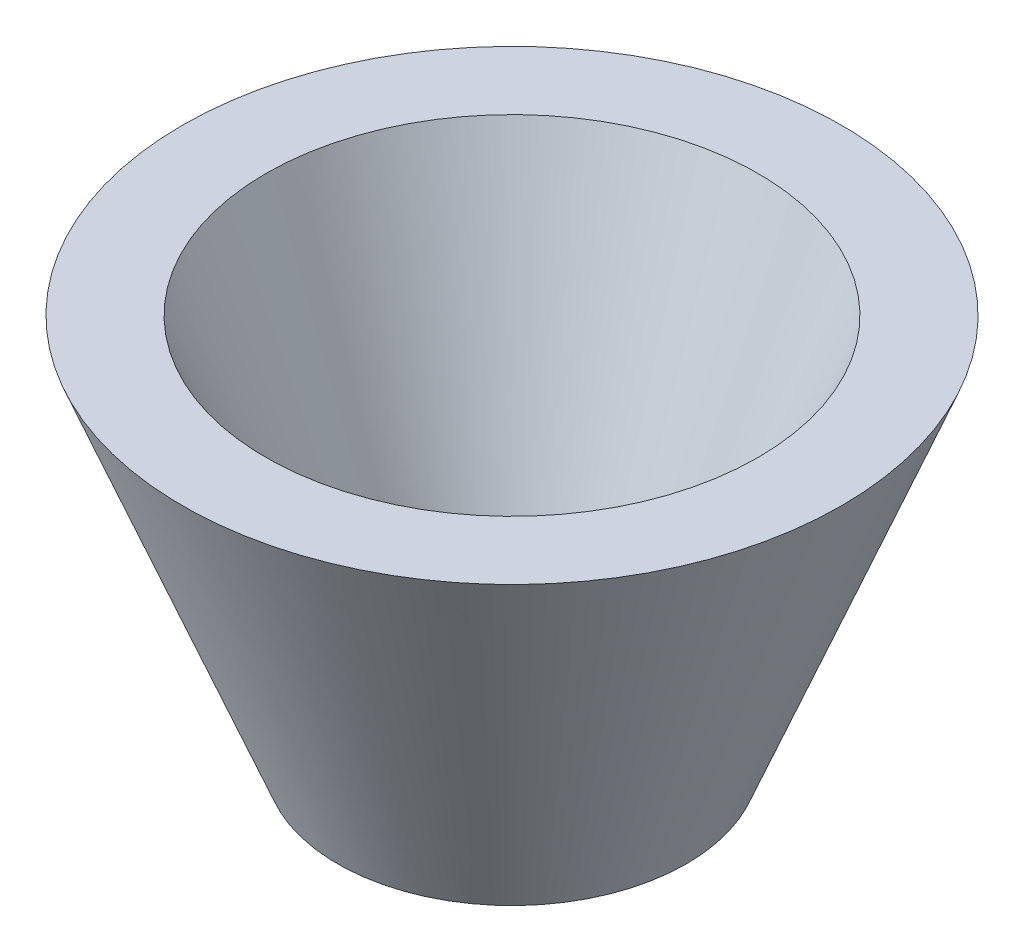
ISO-10303-21;
HEADER;
FILE_DESCRIPTION(('STEP AP214'),'2;1');
FILE_NAME('part.step','',(''),(''),'','','');
FILE_SCHEMA(('AUTOMOTIVE_DESIGN { 1 0 10303 214 1 1 1 1 }'));
ENDSEC;
DATA;
#1=APPLICATION_CONTEXT('core data for automotive mechanical design processes');
#2=APPLICATION_PROTOCOL_DEFINITION('international standard','automotive_design',2000,#1);
#3=PRODUCT_CONTEXT('',#1,'mechanical');
#4=PRODUCT('Part','Part','',(#3));
#5=PRODUCT_RELATED_PRODUCT_CATEGORY('part','',(#4));
#6=PRODUCT_DEFINITION_FORMATION('','',#4);
#7=PRODUCT_DEFINITION_CONTEXT('part definition',#1,'design');
#8=PRODUCT_DEFINITION('design','',#6,#7);
#9=PRODUCT_DEFINITION_SHAPE('','',#8);
#10=(LENGTH_UNIT() NAMED_UNIT(*) SI_UNIT(.MILLI.,.METRE.));
#11=(NAMED_UNIT(*) PLANE_ANGLE_UNIT() SI_UNIT($,.RADIAN.));
#12=(NAMED_UNIT(*) SI_UNIT($,.STERADIAN.) SOLID_ANGLE_UNIT());
#13=UNCERTAINTY_MEASURE_WITH_UNIT(LENGTH_MEASURE(1.E-05),#10,'distance_accuracy_value','');
#14=(GEOMETRIC_REPRESENTATION_CONTEXT(3) GLOBAL_UNCERTAINTY_ASSIGNED_CONTEXT((#13)) GLOBAL_UNIT_ASSIGNED_CONTEXT((#10,
#11,#12)) REPRESENTATION_CONTEXT('',''));
#15=CARTESIAN_POINT('',(0.,0.,0.));
#16=DIRECTION('',(0.,0.,1.));
#17=DIRECTION('',(1.,0.,0.));
#18=AXIS2_PLACEMENT_3D('',#15,#16,#17);
#19=CARTESIAN_POINT('',(0.,0.,0.));
#20=DIRECTION('',(0.,1.,0.));
#21=DIRECTION('',(-1.,0.,0.));
#22=AXIS2_PLACEMENT_3D('',#19,#20,#21);
#23=PLANE('',#22);
#24=CARTESIAN_POINT('',(0.,0.,0.));
#25=DIRECTION('',(0.,1.,0.));
#26=DIRECTION('',(-1.,0.,0.));
#27=AXIS2_PLACEMENT_3D('',#24,#25,#26);
#28=CIRCLE('',#27,4.5);
#29=CARTESIAN_POINT('',(-4.5,0.,0.));
#30=VERTEX_POINT('',#29);
#31=EDGE_CURVE('E10',#30,#30,#28,.T.);
#32=ORIENTED_EDGE('',*,*,#31,.F.);
#33=EDGE_LOOP('',(#32));
#34=FACE_BOUND('',#33,.T.);
#35=ADVANCED_FACE('F39',(#34),#23,.F.);
#36=CARTESIAN_POINT('',(0.,0.,0.));
#37=DIRECTION('',(0.,1.,0.));
#38=DIRECTION('',(-1.,0.,0.));
#39=AXIS2_PLACEMENT_3D('',#36,#37,#38);
#40=CONICAL_SURFACE('',#39,4.5,0.380506377112365);
#41=CARTESIAN_POINT('',(0.,10.,0.));
#42=DIRECTION('',(0.,1.,0.));
#43=DIRECTION('',(-1.,0.,0.));
#44=AXIS2_PLACEMENT_3D('',#41,#42,#43);
#45=CIRCLE('',#44,8.5);
#46=CARTESIAN_POINT('',(-8.5,10.,0.));
#47=VERTEX_POINT('',#46);
#48=EDGE_CURVE('E45',#47,#47,#45,.T.);
#49=ORIENTED_EDGE('',*,*,#48,.F.);
#50=EDGE_LOOP('',(#49));
#51=FACE_BOUND('',#50,.T.);
#52=ORIENTED_EDGE('',*,*,#31,.T.);
#53=EDGE_LOOP('',(#52));
#54=FACE_BOUND('',#53,.T.);
#55=ADVANCED_FACE('F65',(#51,#54),#40,.T.);
#56=CARTESIAN_POINT('',(8.5,10.,0.));
#57=DIRECTION('',(0.,-1.,0.));
#58=DIRECTION('',(1.,0.,0.));
#59=AXIS2_PLACEMENT_3D('',#56,#57,#58);
#60=PLANE('',#59);
#61=CARTESIAN_POINT('',(0.,10.,0.));
#62=DIRECTION('',(0.,-1.,0.));
#63=DIRECTION('',(1.,0.,0.));
#64=AXIS2_PLACEMENT_3D('',#61,#62,#63);
#65=CIRCLE('',#64,6.3459340771462);
#66=CARTESIAN_POINT('',(6.3459340771462,10.,0.));
#67=VERTEX_POINT('',#66);
#68=EDGE_CURVE('E53',#67,#67,#65,.F.);
#69=ORIENTED_EDGE('',*,*,#68,.F.);
#70=EDGE_LOOP('',(#69));
#71=FACE_BOUND('',#70,.T.);
#72=ORIENTED_EDGE('',*,*,#48,.T.);
#73=EDGE_LOOP('',(#72));
#74=FACE_BOUND('',#73,.T.);
#75=ADVANCED_FACE('F62',(#71,#74),#60,.F.);
#76=CARTESIAN_POINT('',(0.,2.,0.));
#77=DIRECTION('',(0.,1.,0.));
#78=DIRECTION('',(-1.,0.,0.));
#79=AXIS2_PLACEMENT_3D('',#76,#77,#78);
#80=PLANE('',#79);
#81=CARTESIAN_POINT('',(0.,2.,0.));
#82=DIRECTION('',(0.,1.,0.));
#83=DIRECTION('',(-1.,0.,0.));
#84=AXIS2_PLACEMENT_3D('',#81,#82,#83);
#85=CIRCLE('',#84,3.1459340771462);
#86=CARTESIAN_POINT('',(-3.1459340771462,2.,0.));
#87=VERTEX_POINT('',#86);
#88=EDGE_CURVE('E49',#87,#87,#85,.T.);
#89=ORIENTED_EDGE('',*,*,#88,.T.);
#90=EDGE_LOOP('',(#89));
#91=FACE_BOUND('',#90,.T.);
#92=ADVANCED_FACE('F64',(#91),#80,.T.);
#93=CARTESIAN_POINT('',(0.,0.742781352708207,0.));
#94=DIRECTION('',(0.,1.,0.));
#95=DIRECTION('',(-1.,0.,0.));
#96=AXIS2_PLACEMENT_3D('',#93,#94,#95);
#97=CONICAL_SURFACE('',#96,2.64304661822948,0.380506377112365);
#98=ORIENTED_EDGE('',*,*,#68,.T.);
#99=EDGE_LOOP('',(#98));
#100=FACE_BOUND('',#99,.T.);
#101=ORIENTED_EDGE('',*,*,#88,.F.);
#102=EDGE_LOOP('',(#101));
#103=FACE_BOUND('',#102,.T.);
#104=ADVANCED_FACE('F59',(#100,#103),#97,.F.);
#105=CLOSED_SHELL('',(#35,#55,#75,#92,#104));
#106=MANIFOLD_SOLID_BREP('B2',#105);
#107=ADVANCED_BREP_SHAPE_REPRESENTATION('',(#18,#106),#14);
#108=SHAPE_DEFINITION_REPRESENTATION(#9,#107);
ENDSEC;
END-ISO-10303-21;
